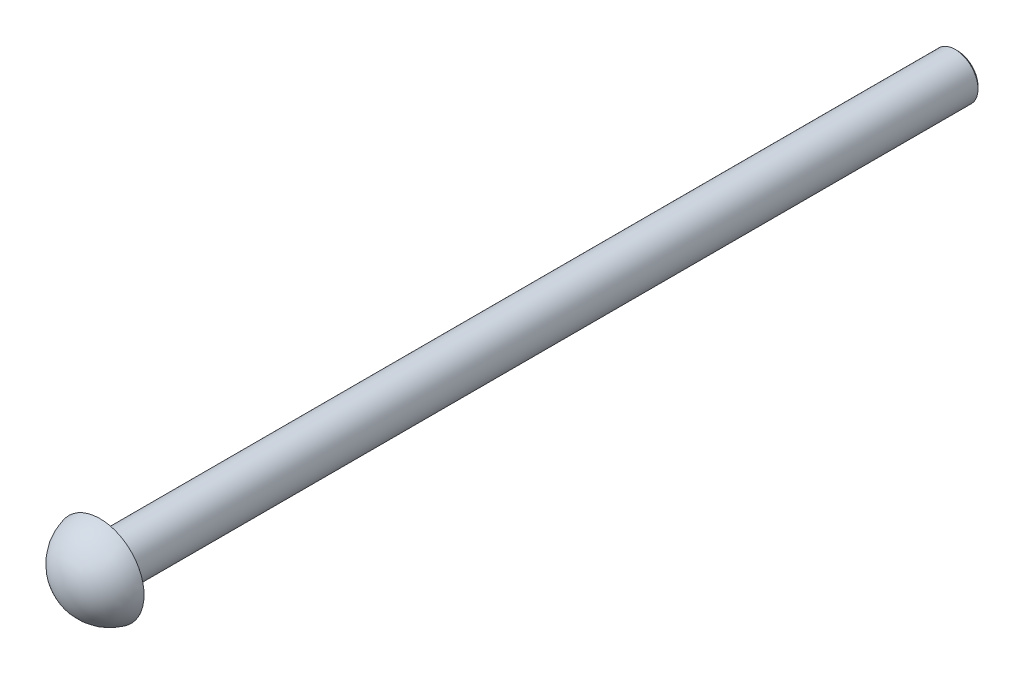
ISO-10303-21;
HEADER;
FILE_DESCRIPTION(('STEP AP214'),'2;1');
FILE_NAME('part.step','',(''),(''),'','','');
FILE_SCHEMA(('AUTOMOTIVE_DESIGN { 1 0 10303 214 1 1 1 1 }'));
ENDSEC;
DATA;
#1=APPLICATION_CONTEXT('core data for automotive mechanical design processes');
#2=APPLICATION_PROTOCOL_DEFINITION('international standard','automotive_design',2000,#1);
#3=PRODUCT_CONTEXT('',#1,'mechanical');
#4=PRODUCT('Part','Part','',(#3));
#5=PRODUCT_RELATED_PRODUCT_CATEGORY('part','',(#4));
#6=PRODUCT_DEFINITION_FORMATION('','',#4);
#7=PRODUCT_DEFINITION_CONTEXT('part definition',#1,'design');
#8=PRODUCT_DEFINITION('design','',#6,#7);
#9=PRODUCT_DEFINITION_SHAPE('','',#8);
#10=(LENGTH_UNIT() NAMED_UNIT(*) SI_UNIT(.MILLI.,.METRE.));
#11=(NAMED_UNIT(*) PLANE_ANGLE_UNIT() SI_UNIT($,.RADIAN.));
#12=(NAMED_UNIT(*) SI_UNIT($,.STERADIAN.) SOLID_ANGLE_UNIT());
#13=UNCERTAINTY_MEASURE_WITH_UNIT(LENGTH_MEASURE(1.E-05),#10,'distance_accuracy_value','');
#14=(GEOMETRIC_REPRESENTATION_CONTEXT(3) GLOBAL_UNCERTAINTY_ASSIGNED_CONTEXT((#13)) GLOBAL_UNIT_ASSIGNED_CONTEXT((#10,
#11,#12)) REPRESENTATION_CONTEXT('',''));
#15=CARTESIAN_POINT('',(0.,0.,0.));
#16=DIRECTION('',(0.,0.,1.));
#17=DIRECTION('',(1.,0.,0.));
#18=AXIS2_PLACEMENT_3D('',#15,#16,#17);
#19=CARTESIAN_POINT('',(0.,0.,138.761645250973));
#20=DIRECTION('',(0.,0.,-1.));
#21=DIRECTION('',(-1.,0.,0.));
#22=AXIS2_PLACEMENT_3D('',#19,#20,#21);
#23=CYLINDRICAL_SURFACE('',#22,2.89875);
#24=CARTESIAN_POINT('',(0.,0.,30.2876452509734));
#25=DIRECTION('',(0.,0.,-1.));
#26=DIRECTION('',(-1.,0.,0.));
#27=AXIS2_PLACEMENT_3D('',#24,#25,#26);
#28=CIRCLE('',#27,2.89875);
#29=CARTESIAN_POINT('',(-2.89875,0.,30.2876452509734));
#30=VERTEX_POINT('',#29);
#31=EDGE_CURVE('E10',#30,#30,#28,.F.);
#32=CARTESIAN_POINT('',(0.,0.,138.761645250973));
#33=DIRECTION('',(0.,0.,1.));
#34=DIRECTION('',(1.,0.,0.));
#35=AXIS2_PLACEMENT_3D('',#32,#33,#34);
#36=CIRCLE('',#35,2.89875);
#37=CARTESIAN_POINT('',(-2.89875,0.,138.761645250973));
#38=VERTEX_POINT('',#37);
#39=EDGE_CURVE('E48',#38,#38,#36,.T.);
#40=CARTESIAN_POINT('',(-2.89875,0.,30.2876452509734));
#41=CARTESIAN_POINT('',(-2.89875,0.,31.4175827509734));
#42=CARTESIAN_POINT('',(-2.89875,0.,32.5475202509734));
#43=CARTESIAN_POINT('',(-2.89875,0.,34.8073952509734));
#44=CARTESIAN_POINT('',(-2.89875,0.,35.9373327509734));
#45=CARTESIAN_POINT('',(-2.89875,0.,38.1972077509734));
#46=CARTESIAN_POINT('',(-2.89875,0.,39.3271452509734));
#47=CARTESIAN_POINT('',(-2.89875,0.,41.5870202509734));
#48=CARTESIAN_POINT('',(-2.89875,0.,42.7169577509734));
#49=CARTESIAN_POINT('',(-2.89875,0.,44.9768327509734));
#50=CARTESIAN_POINT('',(-2.89875,0.,46.1067702509734));
#51=CARTESIAN_POINT('',(-2.89875,0.,48.3666452509734));
#52=CARTESIAN_POINT('',(-2.89875,0.,49.4965827509734));
#53=CARTESIAN_POINT('',(-2.89875,0.,51.7564577509734));
#54=CARTESIAN_POINT('',(-2.89875,0.,52.8863952509734));
#55=CARTESIAN_POINT('',(-2.89875,0.,55.1462702509734));
#56=CARTESIAN_POINT('',(-2.89875,0.,56.2762077509734));
#57=CARTESIAN_POINT('',(-2.89875,0.,58.5360827509734));
#58=CARTESIAN_POINT('',(-2.89875,0.,59.6660202509734));
#59=CARTESIAN_POINT('',(-2.89875,0.,61.9258952509734));
#60=CARTESIAN_POINT('',(-2.89875,0.,63.0558327509734));
#61=CARTESIAN_POINT('',(-2.89875,0.,65.3157077509734));
#62=CARTESIAN_POINT('',(-2.89875,0.,66.4456452509734));
#63=CARTESIAN_POINT('',(-2.89875,0.,68.7055202509734));
#64=CARTESIAN_POINT('',(-2.89875,0.,69.8354577509734));
#65=CARTESIAN_POINT('',(-2.89875,0.,72.0953327509734));
#66=CARTESIAN_POINT('',(-2.89875,0.,73.2252702509734));
#67=CARTESIAN_POINT('',(-2.89875,0.,75.4851452509734));
#68=CARTESIAN_POINT('',(-2.89875,0.,76.6150827509734));
#69=CARTESIAN_POINT('',(-2.89875,0.,78.8749577509734));
#70=CARTESIAN_POINT('',(-2.89875,0.,80.0048952509734));
#71=CARTESIAN_POINT('',(-2.89875,0.,82.2647702509734));
#72=CARTESIAN_POINT('',(-2.89875,0.,83.3947077509734));
#73=CARTESIAN_POINT('',(-2.89875,0.,85.6545827509734));
#74=CARTESIAN_POINT('',(-2.89875,0.,86.7845202509734));
#75=CARTESIAN_POINT('',(-2.89875,0.,89.0443952509734));
#76=CARTESIAN_POINT('',(-2.89875,0.,90.1743327509734));
#77=CARTESIAN_POINT('',(-2.89875,0.,92.4342077509734));
#78=CARTESIAN_POINT('',(-2.89875,0.,93.5641452509734));
#79=CARTESIAN_POINT('',(-2.89875,0.,95.8240202509734));
#80=CARTESIAN_POINT('',(-2.89875,0.,96.9539577509734));
#81=CARTESIAN_POINT('',(-2.89875,0.,99.2138327509734));
#82=CARTESIAN_POINT('',(-2.89875,0.,100.343770250973));
#83=CARTESIAN_POINT('',(-2.89875,0.,102.603645250973));
#84=CARTESIAN_POINT('',(-2.89875,0.,103.733582750973));
#85=CARTESIAN_POINT('',(-2.89875,0.,105.993457750973));
#86=CARTESIAN_POINT('',(-2.89875,0.,107.123395250973));
#87=CARTESIAN_POINT('',(-2.89875,0.,109.383270250973));
#88=CARTESIAN_POINT('',(-2.89875,0.,110.513207750973));
#89=CARTESIAN_POINT('',(-2.89875,0.,112.773082750973));
#90=CARTESIAN_POINT('',(-2.89875,0.,113.903020250973));
#91=CARTESIAN_POINT('',(-2.89875,0.,116.162895250973));
#92=CARTESIAN_POINT('',(-2.89875,0.,117.292832750973));
#93=CARTESIAN_POINT('',(-2.89875,0.,119.552707750973));
#94=CARTESIAN_POINT('',(-2.89875,0.,120.682645250973));
#95=CARTESIAN_POINT('',(-2.89875,0.,122.942520250973));
#96=CARTESIAN_POINT('',(-2.89875,0.,124.072457750973));
#97=CARTESIAN_POINT('',(-2.89875,0.,126.332332750973));
#98=CARTESIAN_POINT('',(-2.89875,0.,127.462270250973));
#99=CARTESIAN_POINT('',(-2.89875,0.,129.722145250973));
#100=CARTESIAN_POINT('',(-2.89875,0.,130.852082750973));
#101=CARTESIAN_POINT('',(-2.89875,0.,133.111957750973));
#102=CARTESIAN_POINT('',(-2.89875,0.,134.241895250973));
#103=CARTESIAN_POINT('',(-2.89875,0.,136.501770250973));
#104=CARTESIAN_POINT('',(-2.89875,0.,137.631707750973));
#105=CARTESIAN_POINT('',(-2.89875,0.,138.761645250973));
#106=B_SPLINE_CURVE_WITH_KNOTS('',3,(#40,#41,#42,#43,#44,#45,#46,#47,#48,#49,#50,#51,#52,#53,
#54,#55,#56,#57,#58,#59,#60,#61,#62,#63,#64,#65,#66,#67,#68,#69,#70,#71,#72,#73,#74,#75,#76,#77,
#78,#79,#80,#81,#82,#83,#84,#85,#86,#87,#88,#89,#90,#91,#92,#93,#94,#95,#96,#97,#98,#99,#100,
#101,#102,#103,#104,#105),.UNSPECIFIED.,.F.,.F.,(4,2,2,2,2,2,2,2,2,2,2,2,2,2,2,2,2,2,2,2,2,2,2,
2,2,2,2,2,2,2,2,2,4),(0.,3.38981250000001,6.779625,10.1694375,13.55925,16.9490625,20.338875,
23.7286875,27.1185,30.5083125,33.898125,37.2879375,40.67775,44.0675625,47.457375,50.8471875,
54.237,57.6268125,61.016625,64.4064375,67.79625,71.1860625,74.575875,77.9656875,81.3555,
84.7453125,88.135125,91.5249375,94.91475,98.3045625,101.694375,105.0841875,108.474),.UNSPECIFIED.);
#107=EDGE_CURVE('BSEAM37',#30,#38,#106,.T.);
#108=ORIENTED_EDGE('',*,*,#31,.T.);
#109=ORIENTED_EDGE('',*,*,#39,.F.);
#110=ORIENTED_EDGE('',*,*,#107,.T.);
#111=ORIENTED_EDGE('',*,*,#107,.F.);
#112=EDGE_LOOP('',(#108,#110,#109,#111));
#113=FACE_BOUND('',#112,.T.);
#114=ADVANCED_FACE('F37',(#113),#23,.T.);
#115=CARTESIAN_POINT('',(0.,0.,138.763145250973));
#116=DIRECTION('',(0.,0.,-1.));
#117=DIRECTION('',(-1.,0.,0.));
#118=AXIS2_PLACEMENT_3D('',#115,#116,#117);
#119=CYLINDRICAL_SURFACE('',#118,5.59506068083406);
#120=CARTESIAN_POINT('',(0.,0.,138.763145250973));
#121=DIRECTION('',(0.,0.,1.));
#122=DIRECTION('',(1.,0.,0.));
#123=AXIS2_PLACEMENT_3D('',#120,#121,#122);
#124=CIRCLE('',#123,5.59506068083406);
#125=CARTESIAN_POINT('',(5.59506068083406,0.,138.763145250973));
#126=VERTEX_POINT('',#125);
#127=EDGE_CURVE('E52',#126,#126,#124,.T.);
#128=ORIENTED_EDGE('',*,*,#127,.F.);
#129=EDGE_LOOP('',(#128));
#130=FACE_BOUND('',#129,.T.);
#131=CARTESIAN_POINT('',(0.,0.,138.761645250973));
#132=DIRECTION('',(0.,0.,1.));
#133=DIRECTION('',(1.,0.,0.));
#134=AXIS2_PLACEMENT_3D('',#131,#132,#133);
#135=CIRCLE('',#134,5.59506068083406);
#136=CARTESIAN_POINT('',(5.59506068083406,0.,138.761645250973));
#137=VERTEX_POINT('',#136);
#138=EDGE_CURVE('E56',#137,#137,#135,.T.);
#139=ORIENTED_EDGE('',*,*,#138,.T.);
#140=EDGE_LOOP('',(#139));
#141=FACE_BOUND('',#140,.T.);
#142=ADVANCED_FACE('F61',(#130,#141),#119,.T.);
#143=CARTESIAN_POINT('',(0.,0.,137.534844804061));
#144=DIRECTION('',(0.,0.,1.));
#145=DIRECTION('',(1.,0.,0.));
#146=AXIS2_PLACEMENT_3D('',#143,#144,#145);
#147=SPHERICAL_SURFACE('',#146,5.72830044691282);
#148=ORIENTED_EDGE('',*,*,#127,.T.);
#149=EDGE_LOOP('',(#148));
#150=FACE_BOUND('',#149,.T.);
#151=ADVANCED_FACE('F66',(#150),#147,.T.);
#152=CARTESIAN_POINT('',(0.,0.,138.761645250973));
#153=DIRECTION('',(0.,0.,1.));
#154=DIRECTION('',(1.,0.,0.));
#155=AXIS2_PLACEMENT_3D('',#152,#153,#154);
#156=PLANE('',#155);
#157=ORIENTED_EDGE('',*,*,#39,.T.);
#158=EDGE_LOOP('',(#157));
#159=FACE_BOUND('',#158,.T.);
#160=ORIENTED_EDGE('',*,*,#138,.F.);
#161=EDGE_LOOP('',(#160));
#162=FACE_BOUND('',#161,.T.);
#163=ADVANCED_FACE('F63',(#159,#162),#156,.F.);
#164=CARTESIAN_POINT('',(0.,0.,29.9876452509734));
#165=DIRECTION('',(0.,0.,-1.));
#166=DIRECTION('',(-1.,0.,0.));
#167=AXIS2_PLACEMENT_3D('',#164,#165,#166);
#168=PLANE('',#167);
#169=CARTESIAN_POINT('',(0.,0.,29.9876452509734));
#170=DIRECTION('',(0.,0.,-1.));
#171=DIRECTION('',(-1.,0.,0.));
#172=AXIS2_PLACEMENT_3D('',#169,#170,#171);
#173=CIRCLE('',#172,2.59875000000003);
#174=CARTESIAN_POINT('',(-2.59875000000003,0.,29.9876452509734));
#175=VERTEX_POINT('',#174);
#176=EDGE_CURVE('E44',#175,#175,#173,.T.);
#177=ORIENTED_EDGE('',*,*,#176,.T.);
#178=EDGE_LOOP('',(#177));
#179=FACE_BOUND('',#178,.T.);
#180=ADVANCED_FACE('F65',(#179),#168,.T.);
#181=CARTESIAN_POINT('',(0.,0.,29.9876452509734));
#182=DIRECTION('',(0.,0.,1.));
#183=DIRECTION('',(1.,0.,0.));
#184=AXIS2_PLACEMENT_3D('',#181,#182,#183);
#185=CONICAL_SURFACE('',#184,2.59875000000002,0.785398163397441);
#186=ORIENTED_EDGE('',*,*,#31,.F.);
#187=EDGE_LOOP('',(#186));
#188=FACE_BOUND('',#187,.T.);
#189=ORIENTED_EDGE('',*,*,#176,.F.);
#190=EDGE_LOOP('',(#189));
#191=FACE_BOUND('',#190,.T.);
#192=ADVANCED_FACE('F39',(#188,#191),#185,.T.);
#193=CLOSED_SHELL('',(#114,#142,#151,#163,#180,#192));
#194=MANIFOLD_SOLID_BREP('B2',#193);
#195=ADVANCED_BREP_SHAPE_REPRESENTATION('',(#18,#194),#14);
#196=SHAPE_DEFINITION_REPRESENTATION(#9,#195);
ENDSEC;
END-ISO-10303-21;
